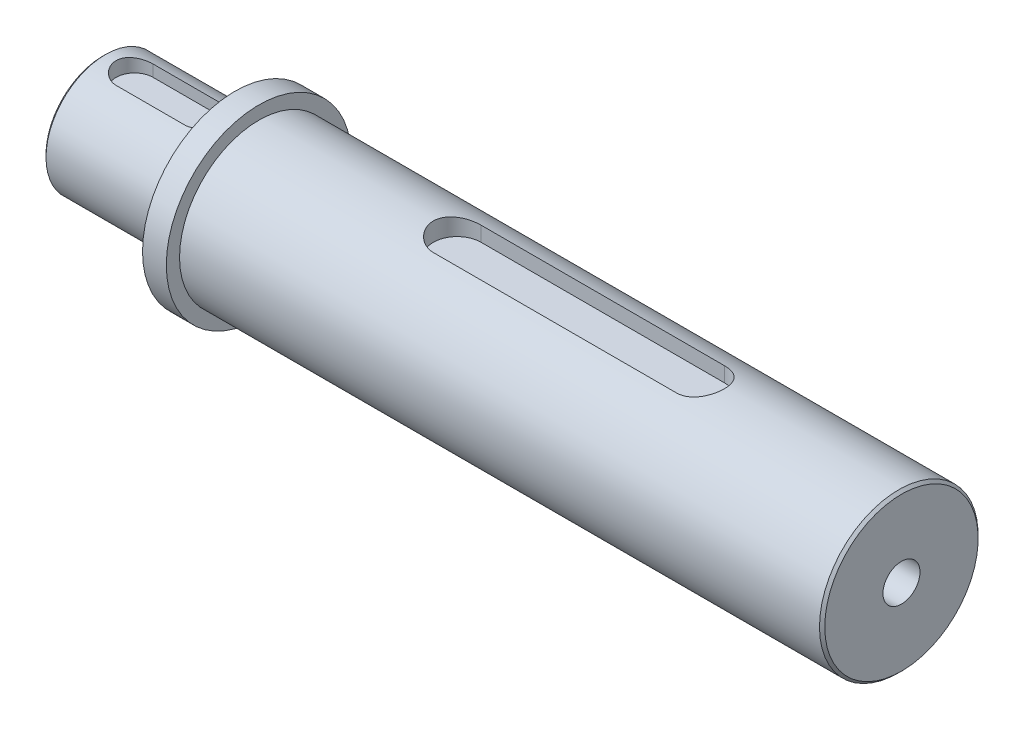
ISO-10303-21;
HEADER;
FILE_DESCRIPTION(('STEP AP214'),'2;1');
FILE_NAME('part.step','',(''),(''),'','','');
FILE_SCHEMA(('AUTOMOTIVE_DESIGN { 1 0 10303 214 1 1 1 1 }'));
ENDSEC;
DATA;
#1=APPLICATION_CONTEXT('core data for automotive mechanical design processes');
#2=APPLICATION_PROTOCOL_DEFINITION('international standard','automotive_design',2000,#1);
#3=PRODUCT_CONTEXT('',#1,'mechanical');
#4=PRODUCT('Part','Part','',(#3));
#5=PRODUCT_RELATED_PRODUCT_CATEGORY('part','',(#4));
#6=PRODUCT_DEFINITION_FORMATION('','',#4);
#7=PRODUCT_DEFINITION_CONTEXT('part definition',#1,'design');
#8=PRODUCT_DEFINITION('design','',#6,#7);
#9=PRODUCT_DEFINITION_SHAPE('','',#8);
#10=(LENGTH_UNIT() NAMED_UNIT(*) SI_UNIT(.MILLI.,.METRE.));
#11=(NAMED_UNIT(*) PLANE_ANGLE_UNIT() SI_UNIT($,.RADIAN.));
#12=(NAMED_UNIT(*) SI_UNIT($,.STERADIAN.) SOLID_ANGLE_UNIT());
#13=UNCERTAINTY_MEASURE_WITH_UNIT(LENGTH_MEASURE(1.E-05),#10,'distance_accuracy_value','');
#14=(GEOMETRIC_REPRESENTATION_CONTEXT(3) GLOBAL_UNCERTAINTY_ASSIGNED_CONTEXT((#13)) GLOBAL_UNIT_ASSIGNED_CONTEXT((#10,
#11,#12)) REPRESENTATION_CONTEXT('',''));
#15=CARTESIAN_POINT('',(0.,0.,0.));
#16=DIRECTION('',(0.,0.,1.));
#17=DIRECTION('',(1.,0.,0.));
#18=AXIS2_PLACEMENT_3D('',#15,#16,#17);
#19=CARTESIAN_POINT('',(-59.,0.,0.));
#20=DIRECTION('',(1.,0.,0.));
#21=DIRECTION('',(0.,0.,-1.));
#22=AXIS2_PLACEMENT_3D('',#19,#20,#21);
#23=PLANE('',#22);
#24=CARTESIAN_POINT('',(-59.,0.,0.));
#25=DIRECTION('',(1.,0.,0.));
#26=DIRECTION('',(0.,0.,-1.));
#27=AXIS2_PLACEMENT_3D('',#24,#25,#26);
#28=CIRCLE('',#27,21.5);
#29=CARTESIAN_POINT('',(-59.,0.,-21.5));
#30=VERTEX_POINT('',#29);
#31=EDGE_CURVE('E196',#30,#30,#28,.F.);
#32=ORIENTED_EDGE('',*,*,#31,.T.);
#33=EDGE_LOOP('',(#32));
#34=FACE_BOUND('',#33,.T.);
#35=ADVANCED_FACE('F49',(#34),#23,.F.);
#36=CARTESIAN_POINT('',(-233.488372093023,0.,0.));
#37=DIRECTION('',(-1.,0.,0.));
#38=DIRECTION('',(0.,0.,1.));
#39=AXIS2_PLACEMENT_3D('',#36,#37,#38);
#40=CYLINDRICAL_SURFACE('',#39,22.5);
#41=DIRECTION('',(-1.,0.,0.));
#42=VECTOR('',#41,1.);
#43=CARTESIAN_POINT('',(-233.488372093023,21.3834047803431,-7.));
#44=LINE('',#43,#42);
#45=CARTESIAN_POINT('',(-47.,21.3834047803431,-7.));
#46=VERTEX_POINT('',#45);
#47=CARTESIAN_POINT('',(-21.,21.3834047803431,-7.));
#48=VERTEX_POINT('',#47);
#49=EDGE_CURVE('E11',#46,#48,#44,.F.);
#50=ORIENTED_EDGE('',*,*,#49,.T.);
#51=CARTESIAN_POINT('',(-21.,21.3834047803431,-7.));
#52=CARTESIAN_POINT('',(-20.8082520370671,21.3833759755726,-7.00002638788773));
#53=CARTESIAN_POINT('',(-20.6165146784963,21.3859829575454,-6.99212250357733));
#54=CARTESIAN_POINT('',(-20.2345109410376,21.3962580072183,-6.96064990633983));
#55=CARTESIAN_POINT('',(-20.0442442213453,21.4039248644627,-6.93708493994703));
#56=CARTESIAN_POINT('',(-19.6670418968984,21.4240824611325,-6.87456915635527));
#57=CARTESIAN_POINT('',(-19.4800987645274,21.4365602872848,-6.83565951993687));
#58=CARTESIAN_POINT('',(-19.1103377044495,21.4659469063578,-6.74281154744467));
#59=CARTESIAN_POINT('',(-18.9275198978557,21.4828558291851,-6.68887277075807));
#60=CARTESIAN_POINT('',(-18.5673718264613,21.5205859002674,-6.56646575510685));
#61=CARTESIAN_POINT('',(-18.3900380326177,21.5414044689111,-6.49800709263032));
#62=CARTESIAN_POINT('',(-18.0418100299766,21.5863628741255,-6.34705748516684));
#63=CARTESIAN_POINT('',(-17.8709182403882,21.6105039428957,-6.26456133146705));
#64=CARTESIAN_POINT('',(-17.5366770200747,21.6614246049305,-6.0861552368472));
#65=CARTESIAN_POINT('',(-17.3733284390492,21.6882044943834,-5.99024378964968));
#66=CARTESIAN_POINT('',(-17.0551072591768,21.7436799451747,-5.78563893862382));
#67=CARTESIAN_POINT('',(-16.9002377255763,21.7723761910783,-5.67694095648713));
#68=CARTESIAN_POINT('',(-16.5953501210494,21.8318094528287,-5.44398558349853));
#69=CARTESIAN_POINT('',(-16.4456243023278,21.8625820218381,-5.31935461263558));
#70=CARTESIAN_POINT('',(-16.1571147416907,21.9244995602667,-5.05809625572507));
#71=CARTESIAN_POINT('',(-16.0183311837246,21.9556445359364,-4.92146866808486));
#72=CARTESIAN_POINT('',(-15.7525307169311,22.0174752796029,-4.63702147167282));
#73=CARTESIAN_POINT('',(-15.6255178897753,22.0481608852367,-4.48919801262154));
#74=CARTESIAN_POINT('',(-15.384184881425,22.1082274768052,-4.18336601580313));
#75=CARTESIAN_POINT('',(-15.2698602862973,22.1376089142809,-4.02536105036415));
#76=CARTESIAN_POINT('',(-15.05217986568,22.1949382761817,-3.6963792649441));
#77=CARTESIAN_POINT('',(-14.9491341978636,22.222838133295,-3.52518859648669));
#78=CARTESIAN_POINT('',(-14.7579226039664,22.2756613074277,-3.17432985879872));
#79=CARTESIAN_POINT('',(-14.66975122526,22.3005857142056,-2.99466492710898));
#80=CARTESIAN_POINT('',(-14.5089724943215,22.3467560378169,-2.62804567748407));
#81=CARTESIAN_POINT('',(-14.4363647200488,22.3680020543947,-2.44109155737342));
#82=CARTESIAN_POINT('',(-14.3073555849817,22.4061975627029,-2.06124657398026));
#83=CARTESIAN_POINT('',(-14.2509536248428,22.4231472133242,-1.86835593054215));
#84=CARTESIAN_POINT('',(-14.1563542059918,22.4518043567541,-1.48406965496812));
#85=CARTESIAN_POINT('',(-14.1176525573853,22.4636563728524,-1.29280885191942));
#86=CARTESIAN_POINT('',(-14.0563330160787,22.4825189363242,-0.90749228143592));
#87=CARTESIAN_POINT('',(-14.0337145685779,22.4895296507013,-0.713436610647575));
#88=CARTESIAN_POINT('',(-14.0047789288171,22.4985094688896,-0.324029619574392));
#89=CARTESIAN_POINT('',(-13.9984590283923,22.5004794102745,-0.128678519946808));
#90=CARTESIAN_POINT('',(-14.0021743753307,22.4993235348161,0.261850976266988));
#91=CARTESIAN_POINT('',(-14.0122092977033,22.4961978192299,0.457029376207847));
#92=CARTESIAN_POINT('',(-14.0479087207521,22.4851350756934,0.839016651756703));
#93=CARTESIAN_POINT('',(-14.073022801591,22.4773675290497,1.0258821970471));
#94=CARTESIAN_POINT('',(-14.1381932844985,22.4573691656826,1.39681014394024));
#95=CARTESIAN_POINT('',(-14.1782546733331,22.4451368594423,1.58087158867605));
#96=CARTESIAN_POINT('',(-14.2729592289679,22.4165350301791,1.94480498225262));
#97=CARTESIAN_POINT('',(-14.3275975334959,22.4001668868012,2.1246783063691));
#98=CARTESIAN_POINT('',(-14.4510377916683,22.3637078769714,2.47918052521277));
#99=CARTESIAN_POINT('',(-14.5198450778458,22.3436156092208,2.65380741699504));
#100=CARTESIAN_POINT('',(-14.6719726897852,22.2999677081418,2.99866751070754));
#101=CARTESIAN_POINT('',(-14.7554547500993,22.2763739905048,3.16882451147412));
#102=CARTESIAN_POINT('',(-14.9357734891551,22.2265007734939,3.50156811170555));
#103=CARTESIAN_POINT('',(-15.0326147468621,22.2002203540359,3.6641520897908));
#104=CARTESIAN_POINT('',(-15.2389613694972,22.1456467231703,3.98072025747789));
#105=CARTESIAN_POINT('',(-15.3484670481018,22.1173534619146,4.13470423393207));
#106=CARTESIAN_POINT('',(-15.5794298038973,22.0594670226099,4.4331736760406));
#107=CARTESIAN_POINT('',(-15.7008872572734,22.0298738036607,4.57765884247863));
#108=CARTESIAN_POINT('',(-15.9602752900053,21.9688936108202,4.86207108102338));
#109=CARTESIAN_POINT('',(-16.0986799606122,21.9374831254957,5.00156109200342));
#110=CARTESIAN_POINT('',(-16.3867058136609,21.8749338799794,5.26840074524968));
#111=CARTESIAN_POINT('',(-16.5363234048154,21.8437950363228,5.39575424517764));
#112=CARTESIAN_POINT('',(-16.8459833597652,21.7826262792731,5.63762072887129));
#113=CARTESIAN_POINT('',(-17.0060326793534,21.7525971271591,5.75212500350363));
#114=CARTESIAN_POINT('',(-17.335396200148,21.6945398510365,5.96735827855914));
#115=CARTESIAN_POINT('',(-17.5047067584282,21.6665109500826,6.06809264161731));
#116=CARTESIAN_POINT('',(-17.8536456872099,21.6129469743072,6.25621355677312));
#117=CARTESIAN_POINT('',(-18.0333733379948,21.5874457842966,6.34342581409758));
#118=CARTESIAN_POINT('',(-18.3999656328203,21.5401290954628,6.50228494842818));
#119=CARTESIAN_POINT('',(-18.5868273037043,21.5183120813529,6.57393822826236));
#120=CARTESIAN_POINT('',(-18.9662171379128,21.4790763704547,6.70102264969051));
#121=CARTESIAN_POINT('',(-19.1587390394159,21.4616530033951,6.75647102650283));
#122=CARTESIAN_POINT('',(-19.5481140518722,21.4317592713336,6.85070294339748));
#123=CARTESIAN_POINT('',(-19.7449651280007,21.4192866297424,6.88949414394962));
#124=CARTESIAN_POINT('',(-20.1180074108463,21.4008759333036,6.94646198663148));
#125=CARTESIAN_POINT('',(-20.2938815607828,21.3943385336146,6.96653718585291));
#126=CARTESIAN_POINT('',(-20.6464993423408,21.3855959359006,6.99330547974964));
#127=CARTESIAN_POINT('',(-20.8232413816784,21.3833845899213,7.00001756560227));
#128=CARTESIAN_POINT('',(-21.,21.3834047803431,7.));
#129=B_SPLINE_CURVE_WITH_KNOTS('',3,(#51,#52,#53,#54,#55,#56,#57,#58,#59,#60,#61,#62,#63,#64,
#65,#66,#67,#68,#69,#70,#71,#72,#73,#74,#75,#76,#77,#78,#79,#80,#81,#82,#83,#84,#85,#86,#87,#88,
#89,#90,#91,#92,#93,#94,#95,#96,#97,#98,#99,#100,#101,#102,#103,#104,#105,#106,#107,#108,#109,
#110,#111,#112,#113,#114,#115,#116,#117,#118,#119,#120,#121,#122,#123,#124,#125,#126,#127,#128),
.UNSPECIFIED.,.F.,.F.,(4,2,2,2,2,2,2,2,2,2,2,2,2,2,2,2,2,2,2,2,2,2,2,2,2,2,2,2,2,2,2,2,2,2,2,2,
2,2,4),(0.,0.57504696980687,1.14995642305858,1.72333336736907,2.29672712327433,2.86974387087759,
3.44297370600941,4.01626795548503,4.58976810539893,5.18076864034279,5.77177910843488,
6.36299375708563,6.95400208730356,7.55850874723002,8.1627933229332,8.76706151008846,
9.37130734653419,9.95706552574569,10.5428034978567,11.1284441375358,11.7140731399452,
12.2795246614735,12.8451649995772,13.4106168982253,13.9762819963941,14.5486246379559,
15.1211639439558,15.6937174338259,16.2662889507273,16.8625896714317,17.4587002177891,
18.055212394766,18.6514915966369,19.2549115963138,19.8580828040919,20.460610136413,
21.0628600748604,21.5937197869136,22.1238245201084),.UNSPECIFIED.);
#130=CARTESIAN_POINT('',(-21.,21.3834047803431,7.));
#131=VERTEX_POINT('',#130);
#132=EDGE_CURVE('E279',#48,#131,#129,.T.);
#133=ORIENTED_EDGE('',*,*,#132,.T.);
#134=DIRECTION('',(-1.,0.,0.));
#135=VECTOR('',#134,1.);
#136=CARTESIAN_POINT('',(-233.488372093023,21.3834047803431,7.));
#137=LINE('',#136,#135);
#138=CARTESIAN_POINT('',(-47.,21.3834047803431,7.));
#139=VERTEX_POINT('',#138);
#140=EDGE_CURVE('E58',#131,#139,#137,.T.);
#141=ORIENTED_EDGE('',*,*,#140,.T.);
#142=CARTESIAN_POINT('',(-47.,21.3834047803431,7.));
#143=CARTESIAN_POINT('',(-47.191747962933,21.3833759755726,7.00002638788773));
#144=CARTESIAN_POINT('',(-47.3834853215038,21.3859829575454,6.99212250357733));
#145=CARTESIAN_POINT('',(-47.7654890589624,21.3962580072183,6.96064990633983));
#146=CARTESIAN_POINT('',(-47.9557557786548,21.4039248644627,6.93708493994703));
#147=CARTESIAN_POINT('',(-48.3329581031017,21.4240824611325,6.87456915635527));
#148=CARTESIAN_POINT('',(-48.5199012354727,21.4365602872848,6.83565951993687));
#149=CARTESIAN_POINT('',(-48.8896622955505,21.4659469063578,6.74281154744467));
#150=CARTESIAN_POINT('',(-49.0724801021443,21.4828558291851,6.68887277075807));
#151=CARTESIAN_POINT('',(-49.4326281735387,21.5205859002674,6.56646575510685));
#152=CARTESIAN_POINT('',(-49.6099619673823,21.5414044689111,6.49800709263032));
#153=CARTESIAN_POINT('',(-49.9581899700234,21.5863628741255,6.34705748516684));
#154=CARTESIAN_POINT('',(-50.1290817596119,21.6105039428958,6.26456133146705));
#155=CARTESIAN_POINT('',(-50.4633229799253,21.6614246049304,6.0861552368472));
#156=CARTESIAN_POINT('',(-50.6266715609508,21.6882044943834,5.99024378964968));
#157=CARTESIAN_POINT('',(-50.9448927408232,21.7436799451747,5.78563893862382));
#158=CARTESIAN_POINT('',(-51.0997622744237,21.7723761910783,5.67694095648713));
#159=CARTESIAN_POINT('',(-51.4046498789507,21.8318094528287,5.44398558349853));
#160=CARTESIAN_POINT('',(-51.5543756976722,21.8625820218381,5.31935461263558));
#161=CARTESIAN_POINT('',(-51.8428852583093,21.9244995602667,5.05809625572507));
#162=CARTESIAN_POINT('',(-51.9816688162754,21.9556445359364,4.92146866808487));
#163=CARTESIAN_POINT('',(-52.247469283069,22.0174752796029,4.63702147167283));
#164=CARTESIAN_POINT('',(-52.3744821102247,22.0481608852367,4.48919801262155));
#165=CARTESIAN_POINT('',(-52.615815118575,22.1082274768052,4.18336601580314));
#166=CARTESIAN_POINT('',(-52.7301397137028,22.1376089142809,4.02536105036415));
#167=CARTESIAN_POINT('',(-52.94782013432,22.1949382761817,3.6963792649441));
#168=CARTESIAN_POINT('',(-53.0508658021364,22.222838133295,3.5251885964867));
#169=CARTESIAN_POINT('',(-53.2420773960336,22.2756613074277,3.17432985879872));
#170=CARTESIAN_POINT('',(-53.33024877474,22.3005857142056,2.99466492710898));
#171=CARTESIAN_POINT('',(-53.4910275056785,22.3467560378169,2.62804567748407));
#172=CARTESIAN_POINT('',(-53.5636352799512,22.3680020543947,2.44109155737343));
#173=CARTESIAN_POINT('',(-53.6926444150183,22.4061975627029,2.06124657398027));
#174=CARTESIAN_POINT('',(-53.7490463751573,22.4231472133242,1.86835593054215));
#175=CARTESIAN_POINT('',(-53.8436457940082,22.4518043567541,1.48406965496813));
#176=CARTESIAN_POINT('',(-53.8823474426148,22.4636563728524,1.29280885191943));
#177=CARTESIAN_POINT('',(-53.9436669839213,22.4825189363242,0.907492281435925));
#178=CARTESIAN_POINT('',(-53.9662854314222,22.4895296507013,0.71343661064758));
#179=CARTESIAN_POINT('',(-53.9952210711829,22.4985094688896,0.324029619574397));
#180=CARTESIAN_POINT('',(-54.0015409716078,22.5004794102745,0.128678519946813));
#181=CARTESIAN_POINT('',(-53.9978256246693,22.4993235348161,-0.261850976266983));
#182=CARTESIAN_POINT('',(-53.9877907022968,22.4961978192299,-0.457029376207842));
#183=CARTESIAN_POINT('',(-53.9520912792479,22.4851350756934,-0.839016651756699));
#184=CARTESIAN_POINT('',(-53.926977198409,22.4773675290497,-1.0258821970471));
#185=CARTESIAN_POINT('',(-53.8618067155016,22.4573691656826,-1.39681014394024));
#186=CARTESIAN_POINT('',(-53.8217453266669,22.4451368594423,-1.58087158867605));
#187=CARTESIAN_POINT('',(-53.7270407710321,22.4165350301791,-1.94480498225262));
#188=CARTESIAN_POINT('',(-53.6724024665041,22.4001668868012,-2.1246783063691));
#189=CARTESIAN_POINT('',(-53.5489622083318,22.3637078769714,-2.47918052521277));
#190=CARTESIAN_POINT('',(-53.4801549221542,22.3436156092208,-2.65380741699504));
#191=CARTESIAN_POINT('',(-53.3280273102148,22.2999677081418,-2.99866751070754));
#192=CARTESIAN_POINT('',(-53.2445452499007,22.2763739905048,-3.16882451147411));
#193=CARTESIAN_POINT('',(-53.0642265108449,22.2265007734939,-3.50156811170555));
#194=CARTESIAN_POINT('',(-52.9673852531379,22.2002203540359,-3.66415208979079));
#195=CARTESIAN_POINT('',(-52.7610386305028,22.1456467231703,-3.98072025747788));
#196=CARTESIAN_POINT('',(-52.6515329518983,22.1173534619146,-4.13470423393206));
#197=CARTESIAN_POINT('',(-52.4205701961027,22.0594670226099,-4.4331736760406));
#198=CARTESIAN_POINT('',(-52.2991127427266,22.0298738036607,-4.57765884247863));
#199=CARTESIAN_POINT('',(-52.0397247099948,21.9688936108202,-4.86207108102338));
#200=CARTESIAN_POINT('',(-51.9013200393878,21.9374831254957,-5.00156109200341));
#201=CARTESIAN_POINT('',(-51.6132941863391,21.8749338799794,-5.26840074524968));
#202=CARTESIAN_POINT('',(-51.4636765951846,21.8437950363228,-5.39575424517764));
#203=CARTESIAN_POINT('',(-51.1540166402348,21.7826262792731,-5.63762072887129));
#204=CARTESIAN_POINT('',(-50.9939673206466,21.7525971271591,-5.75212500350363));
#205=CARTESIAN_POINT('',(-50.664603799852,21.6945398510365,-5.96735827855914));
#206=CARTESIAN_POINT('',(-50.4952932415719,21.6665109500826,-6.06809264161731));
#207=CARTESIAN_POINT('',(-50.1463543127901,21.6129469743072,-6.25621355677312));
#208=CARTESIAN_POINT('',(-49.9666266620052,21.5874457842966,-6.34342581409758));
#209=CARTESIAN_POINT('',(-49.6000343671798,21.5401290954628,-6.50228494842818));
#210=CARTESIAN_POINT('',(-49.4131726962958,21.5183120813529,-6.57393822826236));
#211=CARTESIAN_POINT('',(-49.0337828620872,21.4790763704547,-6.70102264969051));
#212=CARTESIAN_POINT('',(-48.8412609605841,21.4616530033951,-6.75647102650283));
#213=CARTESIAN_POINT('',(-48.4518859481278,21.4317592713336,-6.85070294339748));
#214=CARTESIAN_POINT('',(-48.2550348719993,21.4192866297424,-6.88949414394962));
#215=CARTESIAN_POINT('',(-47.8819925891537,21.4008759333036,-6.94646198663148));
#216=CARTESIAN_POINT('',(-47.7061184392172,21.3943385336146,-6.96653718585291));
#217=CARTESIAN_POINT('',(-47.3535006576592,21.3855959359006,-6.99330547974964));
#218=CARTESIAN_POINT('',(-47.1767586183216,21.3833845899213,-7.00001756560227));
#219=CARTESIAN_POINT('',(-47.,21.3834047803431,-7.));
#220=B_SPLINE_CURVE_WITH_KNOTS('',3,(#142,#143,#144,#145,#146,#147,#148,#149,#150,#151,#152,
#153,#154,#155,#156,#157,#158,#159,#160,#161,#162,#163,#164,#165,#166,#167,#168,#169,#170,#171,
#172,#173,#174,#175,#176,#177,#178,#179,#180,#181,#182,#183,#184,#185,#186,#187,#188,#189,#190,
#191,#192,#193,#194,#195,#196,#197,#198,#199,#200,#201,#202,#203,#204,#205,#206,#207,#208,#209,
#210,#211,#212,#213,#214,#215,#216,#217,#218,#219),.UNSPECIFIED.,.F.,.F.,(4,2,2,2,2,2,2,2,2,2,2,
2,2,2,2,2,2,2,2,2,2,2,2,2,2,2,2,2,2,2,2,2,2,2,2,2,2,2,4),(0.,0.57504696980687,1.14995642305858,
1.72333336736907,2.29672712327433,2.86974387087759,3.44297370600941,4.01626795548503,
4.58976810539893,5.1807686403428,5.77177910843488,6.36299375708563,6.95400208730355,
7.55850874723002,8.16279332293319,8.76706151008845,9.37130734653418,9.95706552574569,
10.5428034978567,11.1284441375358,11.7140731399452,12.2795246614735,12.8451649995772,
13.4106168982253,13.9762819963941,14.5486246379559,15.1211639439558,15.6937174338259,
16.2662889507273,16.8625896714317,17.4587002177891,18.055212394766,18.6514915966369,
19.2549115963138,19.8580828040919,20.460610136413,21.0628600748604,21.5937197869136,
22.1238245201084),.UNSPECIFIED.);
#221=EDGE_CURVE('E65',#139,#46,#220,.T.);
#222=ORIENTED_EDGE('',*,*,#221,.T.);
#223=EDGE_LOOP('',(#50,#133,#141,#222));
#224=FACE_BOUND('',#223,.T.);
#225=CARTESIAN_POINT('',(-58.,0.,0.));
#226=DIRECTION('',(1.,0.,0.));
#227=DIRECTION('',(0.,0.,-1.));
#228=AXIS2_PLACEMENT_3D('',#225,#226,#227);
#229=CIRCLE('',#228,22.5);
#230=CARTESIAN_POINT('',(-58.,0.,-22.5));
#231=VERTEX_POINT('',#230);
#232=EDGE_CURVE('E199',#231,#231,#229,.T.);
#233=ORIENTED_EDGE('',*,*,#232,.T.);
#234=EDGE_LOOP('',(#233));
#235=FACE_BOUND('',#234,.T.);
#236=CARTESIAN_POINT('',(-9.00000000000001,0.,0.));
#237=DIRECTION('',(-1.,0.,0.));
#238=DIRECTION('',(0.,0.,1.));
#239=AXIS2_PLACEMENT_3D('',#236,#237,#238);
#240=CIRCLE('',#239,22.5);
#241=CARTESIAN_POINT('',(-9.00000000000001,0.,22.5));
#242=VERTEX_POINT('',#241);
#243=EDGE_CURVE('E187',#242,#242,#240,.T.);
#244=ORIENTED_EDGE('',*,*,#243,.T.);
#245=EDGE_LOOP('',(#244));
#246=FACE_BOUND('',#245,.T.);
#247=ADVANCED_FACE('F259',(#224,#235,#246),#40,.T.);
#248=CARTESIAN_POINT('',(-9.,22.5,0.));
#249=DIRECTION('',(1.,0.,0.));
#250=DIRECTION('',(0.,0.,-1.));
#251=AXIS2_PLACEMENT_3D('',#248,#249,#250);
#252=PLANE('',#251);
#253=ORIENTED_EDGE('',*,*,#243,.F.);
#254=EDGE_LOOP('',(#253));
#255=FACE_BOUND('',#254,.T.);
#256=CARTESIAN_POINT('',(-9.00000000000001,0.,0.));
#257=DIRECTION('',(-1.,0.,0.));
#258=DIRECTION('',(0.,0.,1.));
#259=AXIS2_PLACEMENT_3D('',#256,#257,#258);
#260=CIRCLE('',#259,35.);
#261=CARTESIAN_POINT('',(-9.00000000000001,0.,35.));
#262=VERTEX_POINT('',#261);
#263=EDGE_CURVE('E184',#262,#262,#260,.T.);
#264=ORIENTED_EDGE('',*,*,#263,.T.);
#265=EDGE_LOOP('',(#264));
#266=FACE_BOUND('',#265,.T.);
#267=ADVANCED_FACE('F266',(#255,#266),#252,.F.);
#268=CARTESIAN_POINT('',(-233.488372093023,0.,0.));
#269=DIRECTION('',(-1.,0.,0.));
#270=DIRECTION('',(0.,0.,1.));
#271=AXIS2_PLACEMENT_3D('',#268,#269,#270);
#272=CYLINDRICAL_SURFACE('',#271,35.);
#273=ORIENTED_EDGE('',*,*,#263,.F.);
#274=EDGE_LOOP('',(#273));
#275=FACE_BOUND('',#274,.T.);
#276=CARTESIAN_POINT('',(0.,0.,0.));
#277=DIRECTION('',(-1.,0.,0.));
#278=DIRECTION('',(0.,0.,1.));
#279=AXIS2_PLACEMENT_3D('',#276,#277,#278);
#280=CIRCLE('',#279,35.);
#281=CARTESIAN_POINT('',(0.,0.,35.));
#282=VERTEX_POINT('',#281);
#283=EDGE_CURVE('E181',#282,#282,#280,.T.);
#284=ORIENTED_EDGE('',*,*,#283,.T.);
#285=EDGE_LOOP('',(#284));
#286=FACE_BOUND('',#285,.T.);
#287=ADVANCED_FACE('F315',(#275,#286),#272,.T.);
#288=CARTESIAN_POINT('',(0.,35.,0.));
#289=DIRECTION('',(-1.,0.,0.));
#290=DIRECTION('',(0.,0.,1.));
#291=AXIS2_PLACEMENT_3D('',#288,#289,#290);
#292=PLANE('',#291);
#293=ORIENTED_EDGE('',*,*,#283,.F.);
#294=EDGE_LOOP('',(#293));
#295=FACE_BOUND('',#294,.T.);
#296=CARTESIAN_POINT('',(0.,0.,0.));
#297=DIRECTION('',(-1.,0.,0.));
#298=DIRECTION('',(0.,0.,1.));
#299=AXIS2_PLACEMENT_3D('',#296,#297,#298);
#300=CIRCLE('',#299,30.);
#301=CARTESIAN_POINT('',(0.,0.,30.));
#302=VERTEX_POINT('',#301);
#303=EDGE_CURVE('E178',#302,#302,#300,.T.);
#304=ORIENTED_EDGE('',*,*,#303,.T.);
#305=EDGE_LOOP('',(#304));
#306=FACE_BOUND('',#305,.T.);
#307=ADVANCED_FACE('F254',(#295,#306),#292,.F.);
#308=CARTESIAN_POINT('',(-233.488372093023,0.,0.));
#309=DIRECTION('',(-1.,0.,0.));
#310=DIRECTION('',(0.,0.,1.));
#311=AXIS2_PLACEMENT_3D('',#308,#309,#310);
#312=CYLINDRICAL_SURFACE('',#311,30.);
#313=DIRECTION('',(-1.,0.,0.));
#314=VECTOR('',#313,1.);
#315=CARTESIAN_POINT('',(-233.488372093023,28.6181760425083,9.00000000000007));
#316=LINE('',#315,#314);
#317=CARTESIAN_POINT('',(167.,28.6181760425083,8.99999999999995));
#318=VERTEX_POINT('',#317);
#319=CARTESIAN_POINT('',(75.,28.6181760425084,8.99999999999998));
#320=VERTEX_POINT('',#319);
#321=EDGE_CURVE('E308',#318,#320,#316,.T.);
#322=ORIENTED_EDGE('',*,*,#321,.T.);
#323=CARTESIAN_POINT('',(75.,28.6181760425084,8.99999999999998));
#324=CARTESIAN_POINT('',(74.752998007507,28.6181405865001,9.00003345939671));
#325=CARTESIAN_POINT('',(74.5060089195199,28.621372640689,8.98983319239617));
#326=CARTESIAN_POINT('',(74.0139158574444,28.634112881822,8.94921297540443));
#327=CARTESIAN_POINT('',(73.7688114720641,28.6436196577286,8.91879757131136));
#328=CARTESIAN_POINT('',(73.2828498093945,28.6686190143342,8.83809683496924));
#329=CARTESIAN_POINT('',(73.0419833577486,28.6840963939842,8.78786195541827));
#330=CARTESIAN_POINT('',(72.5655565373032,28.7205524231494,8.66797644398645));
#331=CARTESIAN_POINT('',(72.3299963074402,28.7415312165304,8.59832530435398));
#332=CARTESIAN_POINT('',(71.8659260167503,28.788350737743,8.44023925805123));
#333=CARTESIAN_POINT('',(71.6374118897254,28.8141885979581,8.35181542628449));
#334=CARTESIAN_POINT('',(71.188688521802,28.8699932485475,8.15682366674916));
#335=CARTESIAN_POINT('',(70.9684823976786,28.8999615692397,8.05024901071208));
#336=CARTESIAN_POINT('',(70.5377875677858,28.9631825718547,7.81973996546712));
#337=CARTESIAN_POINT('',(70.3273010046742,28.9964359729426,7.69580177256468));
#338=CARTESIAN_POINT('',(69.9173534237016,29.0653136323446,7.43143303022373));
#339=CARTESIAN_POINT('',(69.7178930017904,29.1009380185789,7.29100159062407));
#340=CARTESIAN_POINT('',(69.3256715718376,29.1746438974894,6.99033485964947));
#341=CARTESIAN_POINT('',(69.133263230757,29.2127664752183,6.82964940558085));
#342=CARTESIAN_POINT('',(68.7625597364897,29.2894651201754,6.4928465452477));
#343=CARTESIAN_POINT('',(68.5842648026719,29.3280411944418,6.31672889920549));
#344=CARTESIAN_POINT('',(68.2428861350594,29.4046069026407,5.95013898095291));
#345=CARTESIAN_POINT('',(68.079805188689,29.4425964280491,5.75966408979827));
#346=CARTESIAN_POINT('',(67.7699680381718,29.5169568074962,5.36558117800529));
#347=CARTESIAN_POINT('',(67.6232113635542,29.5533277081659,5.16197353612441));
#348=CARTESIAN_POINT('',(67.3441339452552,29.6242077163885,4.73849718132953));
#349=CARTESIAN_POINT('',(67.2121803023362,29.658661813966,4.51837706673785));
#350=CARTESIAN_POINT('',(66.9674020553815,29.7238744604387,4.06733115303334));
#351=CARTESIAN_POINT('',(66.8545699990986,29.7546344476697,3.83640960853696));
#352=CARTESIAN_POINT('',(66.6488958571502,29.8115945655747,3.36528194598862));
#353=CARTESIAN_POINT('',(66.5560536753277,29.8377947181827,3.12507587260452));
#354=CARTESIAN_POINT('',(66.3911725141685,29.8848734626085,2.63712035524283));
#355=CARTESIAN_POINT('',(66.3191328229667,29.9057522365219,2.38937116971268));
#356=CARTESIAN_POINT('',(66.1982730601948,29.941061331276,1.89536420438089));
#357=CARTESIAN_POINT('',(66.1488479668197,29.9556589630829,1.64926633052947));
#358=CARTESIAN_POINT('',(66.0707030084018,29.9788416815619,1.15352379315114));
#359=CARTESIAN_POINT('',(66.0419827858385,29.9874268720535,0.903879190943102));
#360=CARTESIAN_POINT('',(66.0055200469338,29.9983393941593,0.402966424419572));
#361=CARTESIAN_POINT('',(65.9977741570742,30.0006677321272,0.151698527712793));
#362=CARTESIAN_POINT('',(66.0033246090844,29.999002647181,-0.350581343787333));
#363=CARTESIAN_POINT('',(66.01662056478,29.995009340286,-0.601593323192848));
#364=CARTESIAN_POINT('',(66.0633631250856,29.981044077567,-1.09342288994221));
#365=CARTESIAN_POINT('',(66.0961494677279,29.9712680697372,-1.33430914925098));
#366=CARTESIAN_POINT('',(66.181042349135,29.9461578587614,-1.81244634025076));
#367=CARTESIAN_POINT('',(66.2331557914066,29.9308216696007,-2.04969594138192));
#368=CARTESIAN_POINT('',(66.356248612581,29.8949991691283,-2.51880063789037));
#369=CARTESIAN_POINT('',(66.4272246093433,29.8745137811266,-2.75065669225752));
#370=CARTESIAN_POINT('',(66.5874748795271,29.828923586039,-3.20749457697024));
#371=CARTESIAN_POINT('',(66.6767500039808,29.8038185641147,-3.432476087044));
#372=CARTESIAN_POINT('',(66.8740516183466,29.7493184326256,-3.87668806606844));
#373=CARTESIAN_POINT('',(66.9822837274525,29.719876910344,-4.09582147298118));
#374=CARTESIAN_POINT('',(67.2159745754834,29.6576865346252,-4.52421097124242));
#375=CARTESIAN_POINT('',(67.3414337702637,29.6249375936747,-4.73346680101804));
#376=CARTESIAN_POINT('',(67.6087101871004,29.5569698355844,-5.14083485006116));
#377=CARTESIAN_POINT('',(67.7505277132877,29.5217509725292,-5.33894686204312));
#378=CARTESIAN_POINT('',(68.049640292076,29.4497271222073,-5.72291425319049));
#379=CARTESIAN_POINT('',(68.2069404749827,29.4129216114778,-5.90876553535889));
#380=CARTESIAN_POINT('',(68.542317505172,29.3372454251292,-6.27392393102438));
#381=CARTESIAN_POINT('',(68.7209596672366,29.2983496702335,-6.45270703921115));
#382=CARTESIAN_POINT('',(69.0926861080326,29.2209397076866,-6.79466140548122));
#383=CARTESIAN_POINT('',(69.2857705368936,29.1824255040065,-6.95783250123522));
#384=CARTESIAN_POINT('',(69.6852587555532,29.1068376154695,-7.26756046865356));
#385=CARTESIAN_POINT('',(69.8916690305412,29.069764646284,-7.41410915370374));
#386=CARTESIAN_POINT('',(70.3163345825549,28.9981541491542,-7.68942708018336));
#387=CARTESIAN_POINT('',(70.5345854313533,28.9636156845518,-7.81820290545196));
#388=CARTESIAN_POINT('',(70.9839527045399,28.8977288400372,-8.05834620717254));
#389=CARTESIAN_POINT('',(71.2151806183502,28.8664179832075,-8.16951557193575));
#390=CARTESIAN_POINT('',(71.6866827613343,28.8083905858122,-8.37184037408444));
#391=CARTESIAN_POINT('',(71.9269532434846,28.7816721672534,-8.46300399669117));
#392=CARTESIAN_POINT('',(72.4146481776668,28.7336951216643,-8.62449218036642));
#393=CARTESIAN_POINT('',(72.6620647898822,28.7124307466957,-8.69483869241491));
#394=CARTESIAN_POINT('',(73.1623397706383,28.6760314846852,-8.81414193876381));
#395=CARTESIAN_POINT('',(73.4151955725624,28.6608937706652,-8.86310853905683));
#396=CARTESIAN_POINT('',(73.8899056053634,28.6388555109984,-8.93404697599351));
#397=CARTESIAN_POINT('',(74.1113125640443,28.6311161572615,-8.9587795689401));
#398=CARTESIAN_POINT('',(74.5551406687085,28.6207689459537,-8.99175392870852));
#399=CARTESIAN_POINT('',(74.7775598393532,28.6181535432698,-9.00001994317505));
#400=CARTESIAN_POINT('',(75.,28.6181760425084,-8.99999999999996));
#401=B_SPLINE_CURVE_WITH_KNOTS('',3,(#323,#324,#325,#326,#327,#328,#329,#330,#331,#332,#333,
#334,#335,#336,#337,#338,#339,#340,#341,#342,#343,#344,#345,#346,#347,#348,#349,#350,#351,#352,
#353,#354,#355,#356,#357,#358,#359,#360,#361,#362,#363,#364,#365,#366,#367,#368,#369,#370,#371,
#372,#373,#374,#375,#376,#377,#378,#379,#380,#381,#382,#383,#384,#385,#386,#387,#388,#389,#390,
#391,#392,#393,#394,#395,#396,#397,#398,#399,#400),.UNSPECIFIED.,.F.,.F.,(4,2,2,2,2,2,2,2,2,2,2,
2,2,2,2,2,2,2,2,2,2,2,2,2,2,2,2,2,2,2,2,2,2,2,2,2,2,2,4),(0.,0.740754427334222,1.48134233314963,
2.22005702890037,2.9587910444774,3.69709045079817,4.43566413291441,5.17439986232902,
5.91317548057238,6.67299483284983,7.4328259929142,8.19279609285031,8.95274428452413,
9.72862284594612,10.5041983256857,11.2797700745965,12.0553152801576,12.8086853230596,
13.5620423568654,14.3152782132959,15.0685002459905,15.7975536825943,16.5268677832721,
17.2560512027952,17.9852685419373,18.7229498830516,19.4606507481147,20.198365330576,
20.9363251890863,21.7025751902776,22.4688331578547,23.2354668872515,24.0018158555427,
24.7762543951557,25.5503754849918,26.3236773560623,27.0966220004576,27.7647196787938,
28.4318328292623),.UNSPECIFIED.);
#402=CARTESIAN_POINT('',(75.,28.6181760425084,-8.99999999999996));
#403=VERTEX_POINT('',#402);
#404=EDGE_CURVE('E202',#320,#403,#401,.T.);
#405=ORIENTED_EDGE('',*,*,#404,.T.);
#406=DIRECTION('',(-1.,0.,0.));
#407=VECTOR('',#406,1.);
#408=CARTESIAN_POINT('',(-233.488372093023,28.6181760425084,-8.99999999999986));
#409=LINE('',#408,#407);
#410=CARTESIAN_POINT('',(167.,28.6181760425084,-8.99999999999986));
#411=VERTEX_POINT('',#410);
#412=EDGE_CURVE('E305',#403,#411,#409,.F.);
#413=ORIENTED_EDGE('',*,*,#412,.T.);
#414=CARTESIAN_POINT('',(167.,28.6181760425084,-8.99999999999998));
#415=CARTESIAN_POINT('',(167.247001992493,28.6181405865001,-9.00003345939672));
#416=CARTESIAN_POINT('',(167.49399108048,28.621372640689,-8.98983319239617));
#417=CARTESIAN_POINT('',(167.986084142556,28.6341128818219,-8.94921297540444));
#418=CARTESIAN_POINT('',(168.231188527936,28.6436196577286,-8.91879757131137));
#419=CARTESIAN_POINT('',(168.717150190605,28.6686190143342,-8.83809683496924));
#420=CARTESIAN_POINT('',(168.958016642251,28.6840963939842,-8.78786195541828));
#421=CARTESIAN_POINT('',(169.434443462697,28.7205524231494,-8.66797644398645));
#422=CARTESIAN_POINT('',(169.67000369256,28.7415312165304,-8.59832530435399));
#423=CARTESIAN_POINT('',(170.13407398325,28.788350737743,-8.44023925805123));
#424=CARTESIAN_POINT('',(170.362588110275,28.8141885979581,-8.35181542628448));
#425=CARTESIAN_POINT('',(170.811311478198,28.8699932485475,-8.15682366674915));
#426=CARTESIAN_POINT('',(171.031517602321,28.8999615692397,-8.05024901071207));
#427=CARTESIAN_POINT('',(171.462212432214,28.9631825718547,-7.81973996546711));
#428=CARTESIAN_POINT('',(171.672698995326,28.9964359729426,-7.69580177256467));
#429=CARTESIAN_POINT('',(172.082646576298,29.0653136323446,-7.43143303022372));
#430=CARTESIAN_POINT('',(172.28210699821,29.1009380185789,-7.29100159062405));
#431=CARTESIAN_POINT('',(172.674328428162,29.1746438974894,-6.99033485964945));
#432=CARTESIAN_POINT('',(172.866736769243,29.2127664752183,-6.82964940558084));
#433=CARTESIAN_POINT('',(173.23744026351,29.2894651201755,-6.49284654524769));
#434=CARTESIAN_POINT('',(173.415735197328,29.3280411944418,-6.31672889920548));
#435=CARTESIAN_POINT('',(173.757113864941,29.4046069026407,-5.95013898095291));
#436=CARTESIAN_POINT('',(173.920194811311,29.4425964280491,-5.75966408979827));
#437=CARTESIAN_POINT('',(174.230031961828,29.5169568074962,-5.36558117800529));
#438=CARTESIAN_POINT('',(174.376788636446,29.5533277081659,-5.16197353612441));
#439=CARTESIAN_POINT('',(174.655866054745,29.6242077163885,-4.73849718132953));
#440=CARTESIAN_POINT('',(174.787819697664,29.658661813966,-4.51837706673785));
#441=CARTESIAN_POINT('',(175.032597944618,29.7238744604387,-4.06733115303334));
#442=CARTESIAN_POINT('',(175.145430000901,29.7546344476697,-3.83640960853696));
#443=CARTESIAN_POINT('',(175.35110414285,29.8115945655747,-3.36528194598862));
#444=CARTESIAN_POINT('',(175.443946324672,29.8377947181827,-3.12507587260451));
#445=CARTESIAN_POINT('',(175.608827485832,29.8848734626085,-2.63712035524282));
#446=CARTESIAN_POINT('',(175.680867177033,29.9057522365219,-2.38937116971268));
#447=CARTESIAN_POINT('',(175.801726939805,29.941061331276,-1.89536420438089));
#448=CARTESIAN_POINT('',(175.85115203318,29.9556589630829,-1.64926633052947));
#449=CARTESIAN_POINT('',(175.929296991598,29.9788416815619,-1.15352379315113));
#450=CARTESIAN_POINT('',(175.958017214161,29.9874268720535,-0.903879190943097));
#451=CARTESIAN_POINT('',(175.994479953066,29.9983393941593,-0.402966424419567));
#452=CARTESIAN_POINT('',(176.002225842926,30.0006677321272,-0.151698527712788));
#453=CARTESIAN_POINT('',(175.996675390916,29.999002647181,0.350581343787338));
#454=CARTESIAN_POINT('',(175.98337943522,29.995009340286,0.601593323192853));
#455=CARTESIAN_POINT('',(175.936636874914,29.981044077567,1.09342288994222));
#456=CARTESIAN_POINT('',(175.903850532272,29.9712680697372,1.33430914925098));
#457=CARTESIAN_POINT('',(175.818957650865,29.9461578587614,1.81244634025077));
#458=CARTESIAN_POINT('',(175.766844208593,29.9308216696007,2.04969594138193));
#459=CARTESIAN_POINT('',(175.643751387419,29.8949991691283,2.51880063789038));
#460=CARTESIAN_POINT('',(175.572775390657,29.8745137811266,2.75065669225752));
#461=CARTESIAN_POINT('',(175.412525120473,29.828923586039,3.20749457697024));
#462=CARTESIAN_POINT('',(175.323249996019,29.8038185641147,3.43247608704401));
#463=CARTESIAN_POINT('',(175.125948381653,29.7493184326256,3.87668806606844));
#464=CARTESIAN_POINT('',(175.017716272547,29.719876910344,4.09582147298117));
#465=CARTESIAN_POINT('',(174.784025424517,29.6576865346252,4.52421097124241));
#466=CARTESIAN_POINT('',(174.658566229736,29.6249375936747,4.73346680101804));
#467=CARTESIAN_POINT('',(174.3912898129,29.5569698355844,5.14083485006116));
#468=CARTESIAN_POINT('',(174.249472286712,29.5217509725292,5.33894686204313));
#469=CARTESIAN_POINT('',(173.950359707924,29.4497271222073,5.72291425319049));
#470=CARTESIAN_POINT('',(173.793059525017,29.4129216114778,5.90876553535888));
#471=CARTESIAN_POINT('',(173.457682494828,29.3372454251292,6.27392393102438));
#472=CARTESIAN_POINT('',(173.279040332763,29.2983496702335,6.45270703921116));
#473=CARTESIAN_POINT('',(172.907313891967,29.2209397076866,6.79466140548124));
#474=CARTESIAN_POINT('',(172.714229463106,29.1824255040065,6.95783250123524));
#475=CARTESIAN_POINT('',(172.314741244447,29.1068376154695,7.26756046865358));
#476=CARTESIAN_POINT('',(172.108330969459,29.069764646284,7.41410915370377));
#477=CARTESIAN_POINT('',(171.683665417445,28.9981541491542,7.68942708018338));
#478=CARTESIAN_POINT('',(171.465414568647,28.9636156845518,7.81820290545197));
#479=CARTESIAN_POINT('',(171.01604729546,28.8977288400372,8.05834620717254));
#480=CARTESIAN_POINT('',(170.78481938165,28.8664179832075,8.16951557193575));
#481=CARTESIAN_POINT('',(170.313317238666,28.8083905858122,8.37184037408444));
#482=CARTESIAN_POINT('',(170.073046756515,28.7816721672534,8.46300399669117));
#483=CARTESIAN_POINT('',(169.585351822333,28.7336951216643,8.6244921803664));
#484=CARTESIAN_POINT('',(169.337935210118,28.7124307466957,8.6948386924149));
#485=CARTESIAN_POINT('',(168.837660229362,28.6760314846852,8.8141419387638));
#486=CARTESIAN_POINT('',(168.584804427438,28.6608937706652,8.86310853905682));
#487=CARTESIAN_POINT('',(168.110094394637,28.6388555109984,8.93404697599351));
#488=CARTESIAN_POINT('',(167.888687435956,28.6311161572615,8.9587795689401));
#489=CARTESIAN_POINT('',(167.444859331291,28.6207689459537,8.99175392870851));
#490=CARTESIAN_POINT('',(167.222440160647,28.6181535432698,9.00001994317504));
#491=CARTESIAN_POINT('',(167.,28.6181760425084,8.99999999999995));
#492=B_SPLINE_CURVE_WITH_KNOTS('',3,(#414,#415,#416,#417,#418,#419,#420,#421,#422,#423,#424,
#425,#426,#427,#428,#429,#430,#431,#432,#433,#434,#435,#436,#437,#438,#439,#440,#441,#442,#443,
#444,#445,#446,#447,#448,#449,#450,#451,#452,#453,#454,#455,#456,#457,#458,#459,#460,#461,#462,
#463,#464,#465,#466,#467,#468,#469,#470,#471,#472,#473,#474,#475,#476,#477,#478,#479,#480,#481,
#482,#483,#484,#485,#486,#487,#488,#489,#490,#491),.UNSPECIFIED.,.F.,.F.,(4,2,2,2,2,2,2,2,2,2,2,
2,2,2,2,2,2,2,2,2,2,2,2,2,2,2,2,2,2,2,2,2,2,2,2,2,2,2,4),(0.,0.740754427334208,1.48134233314964,
2.22005702890041,2.95879104447741,3.6970904507982,4.43566413291445,5.17439986232907,
5.91317548057242,6.67299483284985,7.43282599291422,8.19279609285031,8.95274428452415,
9.72862284594614,10.5041983256857,11.2797700745965,12.0553152801576,12.8086853230596,
13.5620423568654,14.3152782132959,15.0685002459905,15.7975536825943,16.5268677832721,
17.2560512027953,17.9852685419373,18.7229498830516,19.4606507481147,20.198365330576,
20.9363251890863,21.7025751902776,22.4688331578547,23.2354668872515,24.0018158555427,
24.7762543951558,25.5503754849918,26.3236773560622,27.0966220004576,27.7647196787938,
28.4318328292623),.UNSPECIFIED.);
#493=EDGE_CURVE('E73',#411,#318,#492,.T.);
#494=ORIENTED_EDGE('',*,*,#493,.T.);
#495=EDGE_LOOP('',(#322,#405,#413,#494));
#496=FACE_BOUND('',#495,.T.);
#497=CARTESIAN_POINT('',(242.,0.,0.));
#498=DIRECTION('',(-1.,0.,0.));
#499=DIRECTION('',(0.,0.,1.));
#500=AXIS2_PLACEMENT_3D('',#497,#498,#499);
#501=CIRCLE('',#500,30.);
#502=CARTESIAN_POINT('',(242.,0.,30.));
#503=VERTEX_POINT('',#502);
#504=EDGE_CURVE('E190',#503,#503,#501,.T.);
#505=ORIENTED_EDGE('',*,*,#504,.T.);
#506=EDGE_LOOP('',(#505));
#507=FACE_BOUND('',#506,.T.);
#508=ORIENTED_EDGE('',*,*,#303,.F.);
#509=EDGE_LOOP('',(#508));
#510=FACE_BOUND('',#509,.T.);
#511=ADVANCED_FACE('F217',(#496,#507,#510),#312,.T.);
#512=CARTESIAN_POINT('',(243.,30.,0.));
#513=DIRECTION('',(-1.,0.,0.));
#514=DIRECTION('',(0.,0.,1.));
#515=AXIS2_PLACEMENT_3D('',#512,#513,#514);
#516=PLANE('',#515);
#517=CARTESIAN_POINT('',(243.,0.,0.));
#518=DIRECTION('',(1.,0.,0.));
#519=DIRECTION('',(0.,0.,-1.));
#520=AXIS2_PLACEMENT_3D('',#517,#518,#519);
#521=CIRCLE('',#520,7.);
#522=CARTESIAN_POINT('',(243.,0.,-7.));
#523=VERTEX_POINT('',#522);
#524=EDGE_CURVE('E165',#523,#523,#521,.T.);
#525=ORIENTED_EDGE('',*,*,#524,.F.);
#526=EDGE_LOOP('',(#525));
#527=FACE_BOUND('',#526,.T.);
#528=CARTESIAN_POINT('',(243.,0.,0.));
#529=DIRECTION('',(-1.,0.,0.));
#530=DIRECTION('',(0.,0.,1.));
#531=AXIS2_PLACEMENT_3D('',#528,#529,#530);
#532=CIRCLE('',#531,28.9999999999999);
#533=CARTESIAN_POINT('',(243.,0.,28.9999999999999));
#534=VERTEX_POINT('',#533);
#535=EDGE_CURVE('E193',#534,#534,#532,.F.);
#536=ORIENTED_EDGE('',*,*,#535,.T.);
#537=EDGE_LOOP('',(#536));
#538=FACE_BOUND('',#537,.T.);
#539=ADVANCED_FACE('F244',(#527,#538),#516,.F.);
#540=CARTESIAN_POINT('',(242.,0.,0.));
#541=DIRECTION('',(-1.,0.,0.));
#542=DIRECTION('',(0.,0.,1.));
#543=AXIS2_PLACEMENT_3D('',#540,#541,#542);
#544=CONICAL_SURFACE('',#543,30.,0.78539816339745);
#545=ORIENTED_EDGE('',*,*,#535,.F.);
#546=EDGE_LOOP('',(#545));
#547=FACE_BOUND('',#546,.T.);
#548=ORIENTED_EDGE('',*,*,#504,.F.);
#549=EDGE_LOOP('',(#548));
#550=FACE_BOUND('',#549,.T.);
#551=ADVANCED_FACE('F246',(#547,#550),#544,.T.);
#552=CARTESIAN_POINT('',(-59.,0.,0.));
#553=DIRECTION('',(1.,0.,0.));
#554=DIRECTION('',(0.,0.,-1.));
#555=AXIS2_PLACEMENT_3D('',#552,#553,#554);
#556=CONICAL_SURFACE('',#555,21.5,0.785398163397436);
#557=ORIENTED_EDGE('',*,*,#232,.F.);
#558=EDGE_LOOP('',(#557));
#559=FACE_BOUND('',#558,.T.);
#560=ORIENTED_EDGE('',*,*,#31,.F.);
#561=EDGE_LOOP('',(#560));
#562=FACE_BOUND('',#561,.T.);
#563=ADVANCED_FACE('F52',(#559,#562),#556,.T.);
#564=CARTESIAN_POINT('',(202.206024333193,0.,0.));
#565=DIRECTION('',(1.,0.,0.));
#566=DIRECTION('',(0.,0.,-1.));
#567=AXIS2_PLACEMENT_3D('',#564,#565,#566);
#568=CONICAL_SURFACE('',#567,6.99999999999999,1.02974425867665);
#569=CARTESIAN_POINT('',(198.,0.,0.));
#570=VERTEX_POINT('',#569);
#571=VERTEX_LOOP('',#570);
#572=FACE_BOUND('',#571,.T.);
#573=CARTESIAN_POINT('',(202.206024333193,0.,0.));
#574=DIRECTION('',(1.,0.,0.));
#575=DIRECTION('',(0.,0.,-1.));
#576=AXIS2_PLACEMENT_3D('',#573,#574,#575);
#577=CIRCLE('',#576,6.99999999999999);
#578=CARTESIAN_POINT('',(202.206024333193,0.,-6.99999999999999));
#579=VERTEX_POINT('',#578);
#580=EDGE_CURVE('E175',#579,#579,#577,.T.);
#581=ORIENTED_EDGE('',*,*,#580,.T.);
#582=EDGE_LOOP('',(#581));
#583=FACE_BOUND('',#582,.T.);
#584=ADVANCED_FACE('F240',(#572,#583),#568,.F.);
#585=CARTESIAN_POINT('',(243.,0.,0.));
#586=DIRECTION('',(1.,0.,0.));
#587=DIRECTION('',(0.,0.,-1.));
#588=AXIS2_PLACEMENT_3D('',#585,#586,#587);
#589=CYLINDRICAL_SURFACE('',#588,6.99999999999999);
#590=ORIENTED_EDGE('',*,*,#580,.F.);
#591=EDGE_LOOP('',(#590));
#592=FACE_BOUND('',#591,.T.);
#593=ORIENTED_EDGE('',*,*,#524,.T.);
#594=EDGE_LOOP('',(#593));
#595=FACE_BOUND('',#594,.T.);
#596=ADVANCED_FACE('F237',(#592,#595),#589,.F.);
#597=CARTESIAN_POINT('',(167.,23.,0.));
#598=DIRECTION('',(0.,1.,0.));
#599=DIRECTION('',(0.,0.,1.));
#600=AXIS2_PLACEMENT_3D('',#597,#598,#599);
#601=CYLINDRICAL_SURFACE('',#600,8.99999999999997);
#602=DIRECTION('',(0.,1.,0.));
#603=VECTOR('',#602,1.);
#604=CARTESIAN_POINT('',(167.,23.,-8.99999999999998));
#605=LINE('',#604,#603);
#606=CARTESIAN_POINT('',(167.,23.,-8.99999999999998));
#607=VERTEX_POINT('',#606);
#608=EDGE_CURVE('E162',#607,#411,#605,.T.);
#609=ORIENTED_EDGE('',*,*,#608,.F.);
#610=CARTESIAN_POINT('',(167.,23.,0.));
#611=DIRECTION('',(0.,1.,0.));
#612=DIRECTION('',(0.,0.,1.));
#613=AXIS2_PLACEMENT_3D('',#610,#611,#612);
#614=CIRCLE('',#613,8.99999999999997);
#615=CARTESIAN_POINT('',(167.,23.,8.99999999999995));
#616=VERTEX_POINT('',#615);
#617=EDGE_CURVE('E146',#616,#607,#614,.T.);
#618=ORIENTED_EDGE('',*,*,#617,.F.);
#619=DIRECTION('',(0.,1.,0.));
#620=VECTOR('',#619,1.);
#621=CARTESIAN_POINT('',(167.,23.,8.99999999999995));
#622=LINE('',#621,#620);
#623=EDGE_CURVE('E163',#616,#318,#622,.T.);
#624=ORIENTED_EDGE('',*,*,#623,.T.);
#625=ORIENTED_EDGE('',*,*,#493,.F.);
#626=EDGE_LOOP('',(#609,#618,#624,#625));
#627=FACE_BOUND('',#626,.T.);
#628=ADVANCED_FACE('F233',(#627),#601,.F.);
#629=CARTESIAN_POINT('',(167.,23.,8.99999999999995));
#630=DIRECTION('',(0.,0.,1.));
#631=DIRECTION('',(1.,0.,0.));
#632=AXIS2_PLACEMENT_3D('',#629,#630,#631);
#633=PLANE('',#632);
#634=ORIENTED_EDGE('',*,*,#623,.F.);
#635=DIRECTION('',(1.,0.,0.));
#636=VECTOR('',#635,1.);
#637=CARTESIAN_POINT('',(167.,23.,8.99999999999995));
#638=LINE('',#637,#636);
#639=CARTESIAN_POINT('',(75.,23.,8.99999999999998));
#640=VERTEX_POINT('',#639);
#641=EDGE_CURVE('E159',#640,#616,#638,.T.);
#642=ORIENTED_EDGE('',*,*,#641,.F.);
#643=DIRECTION('',(0.,1.,0.));
#644=VECTOR('',#643,1.);
#645=CARTESIAN_POINT('',(75.,23.,8.99999999999998));
#646=LINE('',#645,#644);
#647=EDGE_CURVE('E166',#640,#320,#646,.T.);
#648=ORIENTED_EDGE('',*,*,#647,.T.);
#649=ORIENTED_EDGE('',*,*,#321,.F.);
#650=EDGE_LOOP('',(#634,#642,#648,#649));
#651=FACE_BOUND('',#650,.T.);
#652=ADVANCED_FACE('F227',(#651),#633,.F.);
#653=CARTESIAN_POINT('',(75.,23.,0.));
#654=DIRECTION('',(0.,1.,0.));
#655=DIRECTION('',(0.,0.,1.));
#656=AXIS2_PLACEMENT_3D('',#653,#654,#655);
#657=CYLINDRICAL_SURFACE('',#656,8.99999999999997);
#658=ORIENTED_EDGE('',*,*,#647,.F.);
#659=CARTESIAN_POINT('',(75.,23.,0.));
#660=DIRECTION('',(0.,1.,0.));
#661=DIRECTION('',(0.,0.,1.));
#662=AXIS2_PLACEMENT_3D('',#659,#660,#661);
#663=CIRCLE('',#662,8.99999999999997);
#664=CARTESIAN_POINT('',(75.,23.,-8.99999999999996));
#665=VERTEX_POINT('',#664);
#666=EDGE_CURVE('E156',#665,#640,#663,.T.);
#667=ORIENTED_EDGE('',*,*,#666,.F.);
#668=DIRECTION('',(0.,1.,0.));
#669=VECTOR('',#668,1.);
#670=CARTESIAN_POINT('',(75.,23.,-8.99999999999996));
#671=LINE('',#670,#669);
#672=EDGE_CURVE('E169',#665,#403,#671,.T.);
#673=ORIENTED_EDGE('',*,*,#672,.T.);
#674=ORIENTED_EDGE('',*,*,#404,.F.);
#675=EDGE_LOOP('',(#658,#667,#673,#674));
#676=FACE_BOUND('',#675,.T.);
#677=ADVANCED_FACE('F221',(#676),#657,.F.);
#678=CARTESIAN_POINT('',(167.,23.,-8.99999999999998));
#679=DIRECTION('',(0.,0.,-1.));
#680=DIRECTION('',(-1.,0.,0.));
#681=AXIS2_PLACEMENT_3D('',#678,#679,#680);
#682=PLANE('',#681);
#683=ORIENTED_EDGE('',*,*,#672,.F.);
#684=DIRECTION('',(-1.,0.,0.));
#685=VECTOR('',#684,1.);
#686=CARTESIAN_POINT('',(167.,23.,-8.99999999999998));
#687=LINE('',#686,#685);
#688=EDGE_CURVE('E153',#607,#665,#687,.T.);
#689=ORIENTED_EDGE('',*,*,#688,.F.);
#690=ORIENTED_EDGE('',*,*,#608,.T.);
#691=ORIENTED_EDGE('',*,*,#412,.F.);
#692=EDGE_LOOP('',(#683,#689,#690,#691));
#693=FACE_BOUND('',#692,.T.);
#694=ADVANCED_FACE('F226',(#693),#682,.F.);
#695=CARTESIAN_POINT('',(167.,23.,0.));
#696=DIRECTION('',(0.,1.,0.));
#697=DIRECTION('',(0.,0.,1.));
#698=AXIS2_PLACEMENT_3D('',#695,#696,#697);
#699=PLANE('',#698);
#700=ORIENTED_EDGE('',*,*,#617,.T.);
#701=ORIENTED_EDGE('',*,*,#688,.T.);
#702=ORIENTED_EDGE('',*,*,#666,.T.);
#703=ORIENTED_EDGE('',*,*,#641,.T.);
#704=EDGE_LOOP('',(#700,#701,#702,#703));
#705=FACE_BOUND('',#704,.T.);
#706=ADVANCED_FACE('F231',(#705),#699,.T.);
#707=CARTESIAN_POINT('',(-47.,17.,0.));
#708=DIRECTION('',(0.,1.,0.));
#709=DIRECTION('',(0.,0.,1.));
#710=AXIS2_PLACEMENT_3D('',#707,#708,#709);
#711=CYLINDRICAL_SURFACE('',#710,7.);
#712=DIRECTION('',(0.,1.,0.));
#713=VECTOR('',#712,1.);
#714=CARTESIAN_POINT('',(-47.,17.,7.));
#715=LINE('',#714,#713);
#716=CARTESIAN_POINT('',(-47.,17.,7.));
#717=VERTEX_POINT('',#716);
#718=EDGE_CURVE('E118',#717,#139,#715,.T.);
#719=ORIENTED_EDGE('',*,*,#718,.F.);
#720=CARTESIAN_POINT('',(-47.,17.,0.));
#721=DIRECTION('',(0.,1.,0.));
#722=DIRECTION('',(0.,0.,1.));
#723=AXIS2_PLACEMENT_3D('',#720,#721,#722);
#724=CIRCLE('',#723,7.);
#725=CARTESIAN_POINT('',(-47.,17.,-7.));
#726=VERTEX_POINT('',#725);
#727=EDGE_CURVE('E122',#726,#717,#724,.T.);
#728=ORIENTED_EDGE('',*,*,#727,.F.);
#729=DIRECTION('',(0.,1.,0.));
#730=VECTOR('',#729,1.);
#731=CARTESIAN_POINT('',(-47.,17.,-7.));
#732=LINE('',#731,#730);
#733=EDGE_CURVE('E144',#726,#46,#732,.T.);
#734=ORIENTED_EDGE('',*,*,#733,.T.);
#735=ORIENTED_EDGE('',*,*,#221,.F.);
#736=EDGE_LOOP('',(#719,#728,#734,#735));
#737=FACE_BOUND('',#736,.T.);
#738=ADVANCED_FACE('F120',(#737),#711,.F.);
#739=CARTESIAN_POINT('',(-47.,17.,-7.));
#740=DIRECTION('',(0.,0.,-1.));
#741=DIRECTION('',(-1.,0.,0.));
#742=AXIS2_PLACEMENT_3D('',#739,#740,#741);
#743=PLANE('',#742);
#744=ORIENTED_EDGE('',*,*,#733,.F.);
#745=DIRECTION('',(-1.,0.,0.));
#746=VECTOR('',#745,1.);
#747=CARTESIAN_POINT('',(-47.,17.,-7.));
#748=LINE('',#747,#746);
#749=CARTESIAN_POINT('',(-21.,17.,-7.));
#750=VERTEX_POINT('',#749);
#751=EDGE_CURVE('E127',#750,#726,#748,.T.);
#752=ORIENTED_EDGE('',*,*,#751,.F.);
#753=DIRECTION('',(0.,1.,0.));
#754=VECTOR('',#753,1.);
#755=CARTESIAN_POINT('',(-21.,17.,-7.));
#756=LINE('',#755,#754);
#757=EDGE_CURVE('E147',#750,#48,#756,.T.);
#758=ORIENTED_EDGE('',*,*,#757,.T.);
#759=ORIENTED_EDGE('',*,*,#49,.F.);
#760=EDGE_LOOP('',(#744,#752,#758,#759));
#761=FACE_BOUND('',#760,.T.);
#762=ADVANCED_FACE('F295',(#761),#743,.F.);
#763=CARTESIAN_POINT('',(-21.,17.,0.));
#764=DIRECTION('',(0.,1.,0.));
#765=DIRECTION('',(0.,0.,1.));
#766=AXIS2_PLACEMENT_3D('',#763,#764,#765);
#767=CYLINDRICAL_SURFACE('',#766,7.);
#768=ORIENTED_EDGE('',*,*,#757,.F.);
#769=CARTESIAN_POINT('',(-21.,17.,0.));
#770=DIRECTION('',(0.,1.,0.));
#771=DIRECTION('',(0.,0.,1.));
#772=AXIS2_PLACEMENT_3D('',#769,#770,#771);
#773=CIRCLE('',#772,7.);
#774=CARTESIAN_POINT('',(-21.,17.,7.));
#775=VERTEX_POINT('',#774);
#776=EDGE_CURVE('E136',#775,#750,#773,.T.);
#777=ORIENTED_EDGE('',*,*,#776,.F.);
#778=DIRECTION('',(0.,1.,0.));
#779=VECTOR('',#778,1.);
#780=CARTESIAN_POINT('',(-21.,17.,7.));
#781=LINE('',#780,#779);
#782=EDGE_CURVE('E126',#775,#131,#781,.T.);
#783=ORIENTED_EDGE('',*,*,#782,.T.);
#784=ORIENTED_EDGE('',*,*,#132,.F.);
#785=EDGE_LOOP('',(#768,#777,#783,#784));
#786=FACE_BOUND('',#785,.T.);
#787=ADVANCED_FACE('F427',(#786),#767,.F.);
#788=CARTESIAN_POINT('',(-47.,17.,7.));
#789=DIRECTION('',(0.,0.,1.));
#790=DIRECTION('',(1.,0.,0.));
#791=AXIS2_PLACEMENT_3D('',#788,#789,#790);
#792=PLANE('',#791);
#793=ORIENTED_EDGE('',*,*,#782,.F.);
#794=DIRECTION('',(1.,0.,0.));
#795=VECTOR('',#794,1.);
#796=CARTESIAN_POINT('',(-47.,17.,7.));
#797=LINE('',#796,#795);
#798=EDGE_CURVE('E130',#717,#775,#797,.T.);
#799=ORIENTED_EDGE('',*,*,#798,.F.);
#800=ORIENTED_EDGE('',*,*,#718,.T.);
#801=ORIENTED_EDGE('',*,*,#140,.F.);
#802=EDGE_LOOP('',(#793,#799,#800,#801));
#803=FACE_BOUND('',#802,.T.);
#804=ADVANCED_FACE('F131',(#803),#792,.F.);
#805=CARTESIAN_POINT('',(-47.,17.,0.));
#806=DIRECTION('',(0.,1.,0.));
#807=DIRECTION('',(0.,0.,1.));
#808=AXIS2_PLACEMENT_3D('',#805,#806,#807);
#809=PLANE('',#808);
#810=ORIENTED_EDGE('',*,*,#727,.T.);
#811=ORIENTED_EDGE('',*,*,#798,.T.);
#812=ORIENTED_EDGE('',*,*,#776,.T.);
#813=ORIENTED_EDGE('',*,*,#751,.T.);
#814=EDGE_LOOP('',(#810,#811,#812,#813));
#815=FACE_BOUND('',#814,.T.);
#816=ADVANCED_FACE('F138',(#815),#809,.T.);
#817=CLOSED_SHELL('',(#35,#247,#267,#287,#307,#511,#539,#551,#563,#584,#596,#628,#652,#677,#694,
#706,#738,#762,#787,#804,#816));
#818=MANIFOLD_SOLID_BREP('B2',#817);
#819=ADVANCED_BREP_SHAPE_REPRESENTATION('',(#18,#818),#14);
#820=SHAPE_DEFINITION_REPRESENTATION(#9,#819);
ENDSEC;
END-ISO-10303-21;
